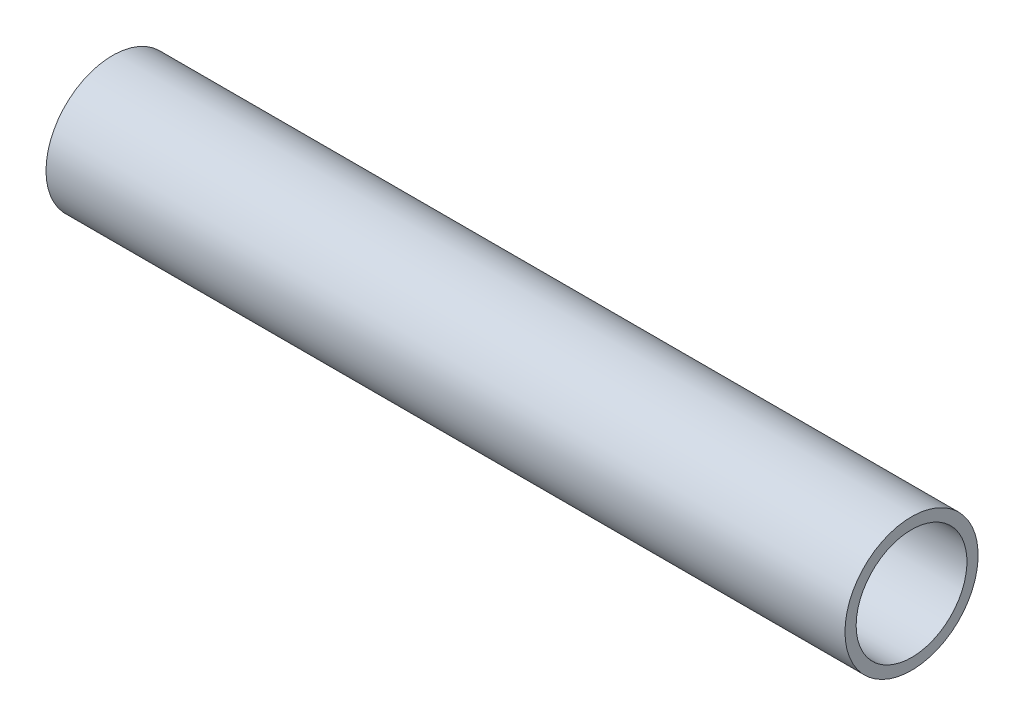
ISO-10303-21;
HEADER;
FILE_DESCRIPTION(('STEP AP214'),'2;1');
FILE_NAME('part.step','',(''),(''),'','','');
FILE_SCHEMA(('AUTOMOTIVE_DESIGN { 1 0 10303 214 1 1 1 1 }'));
ENDSEC;
DATA;
#1=APPLICATION_CONTEXT('core data for automotive mechanical design processes');
#2=APPLICATION_PROTOCOL_DEFINITION('international standard','automotive_design',2000,#1);
#3=PRODUCT_CONTEXT('',#1,'mechanical');
#4=PRODUCT('Part','Part','',(#3));
#5=PRODUCT_RELATED_PRODUCT_CATEGORY('part','',(#4));
#6=PRODUCT_DEFINITION_FORMATION('','',#4);
#7=PRODUCT_DEFINITION_CONTEXT('part definition',#1,'design');
#8=PRODUCT_DEFINITION('design','',#6,#7);
#9=PRODUCT_DEFINITION_SHAPE('','',#8);
#10=(LENGTH_UNIT() NAMED_UNIT(*) SI_UNIT(.MILLI.,.METRE.));
#11=(NAMED_UNIT(*) PLANE_ANGLE_UNIT() SI_UNIT($,.RADIAN.));
#12=(NAMED_UNIT(*) SI_UNIT($,.STERADIAN.) SOLID_ANGLE_UNIT());
#13=UNCERTAINTY_MEASURE_WITH_UNIT(LENGTH_MEASURE(1.E-05),#10,'distance_accuracy_value','');
#14=(GEOMETRIC_REPRESENTATION_CONTEXT(3) GLOBAL_UNCERTAINTY_ASSIGNED_CONTEXT((#13)) GLOBAL_UNIT_ASSIGNED_CONTEXT((#10,
#11,#12)) REPRESENTATION_CONTEXT('',''));
#15=CARTESIAN_POINT('',(0.,0.,0.));
#16=DIRECTION('',(0.,0.,1.));
#17=DIRECTION('',(1.,0.,0.));
#18=AXIS2_PLACEMENT_3D('',#15,#16,#17);
#19=CARTESIAN_POINT('',(25.2027542670464,670.040757757043,0.));
#20=DIRECTION('',(1.,0.,0.));
#21=DIRECTION('',(0.,0.,-1.));
#22=AXIS2_PLACEMENT_3D('',#19,#20,#21);
#23=CYLINDRICAL_SURFACE('',#22,5.28320000000004);
#24=CARTESIAN_POINT('',(25.2027542670464,670.040757757043,0.));
#25=DIRECTION('',(-1.,0.,0.));
#26=DIRECTION('',(0.,0.,1.));
#27=AXIS2_PLACEMENT_3D('',#24,#25,#26);
#28=CIRCLE('',#27,5.28320000000004);
#29=CARTESIAN_POINT('',(25.2027542670464,670.040757757043,5.28320000000004));
#30=VERTEX_POINT('',#29);
#31=EDGE_CURVE('E45',#30,#30,#28,.T.);
#32=ORIENTED_EDGE('',*,*,#31,.T.);
#33=EDGE_LOOP('',(#32));
#34=FACE_BOUND('',#33,.T.);
#35=CARTESIAN_POINT('',(101.402754267046,670.040757757043,0.));
#36=DIRECTION('',(-1.,0.,0.));
#37=DIRECTION('',(0.,0.,1.));
#38=AXIS2_PLACEMENT_3D('',#35,#36,#37);
#39=CIRCLE('',#38,5.28320000000004);
#40=CARTESIAN_POINT('',(101.402754267046,670.040757757043,5.28320000000004));
#41=VERTEX_POINT('',#40);
#42=EDGE_CURVE('E51',#41,#41,#39,.T.);
#43=ORIENTED_EDGE('',*,*,#42,.F.);
#44=EDGE_LOOP('',(#43));
#45=FACE_BOUND('',#44,.T.);
#46=ADVANCED_FACE('F38',(#34,#45),#23,.F.);
#47=CARTESIAN_POINT('',(25.2027542670464,670.040757757043,0.));
#48=DIRECTION('',(1.,0.,0.));
#49=DIRECTION('',(0.,0.,-1.));
#50=AXIS2_PLACEMENT_3D('',#47,#48,#49);
#51=CYLINDRICAL_SURFACE('',#50,6.35000000000005);
#52=CARTESIAN_POINT('',(25.2027542670464,670.040757757043,0.));
#53=DIRECTION('',(-1.,0.,0.));
#54=DIRECTION('',(0.,0.,1.));
#55=AXIS2_PLACEMENT_3D('',#52,#53,#54);
#56=CIRCLE('',#55,6.35000000000005);
#57=CARTESIAN_POINT('',(25.2027542670464,670.040757757043,6.35000000000005));
#58=VERTEX_POINT('',#57);
#59=EDGE_CURVE('E11',#58,#58,#56,.T.);
#60=ORIENTED_EDGE('',*,*,#59,.F.);
#61=EDGE_LOOP('',(#60));
#62=FACE_BOUND('',#61,.T.);
#63=CARTESIAN_POINT('',(101.402754267046,670.040757757043,0.));
#64=DIRECTION('',(-1.,0.,0.));
#65=DIRECTION('',(0.,0.,1.));
#66=AXIS2_PLACEMENT_3D('',#63,#64,#65);
#67=CIRCLE('',#66,6.35000000000005);
#68=CARTESIAN_POINT('',(101.402754267046,670.040757757043,6.35000000000005));
#69=VERTEX_POINT('',#68);
#70=EDGE_CURVE('E41',#69,#69,#67,.T.);
#71=ORIENTED_EDGE('',*,*,#70,.T.);
#72=EDGE_LOOP('',(#71));
#73=FACE_BOUND('',#72,.T.);
#74=ADVANCED_FACE('F58',(#62,#73),#51,.T.);
#75=CARTESIAN_POINT('',(25.2027542670464,670.040757757043,0.));
#76=DIRECTION('',(-1.,0.,0.));
#77=DIRECTION('',(0.,0.,1.));
#78=AXIS2_PLACEMENT_3D('',#75,#76,#77);
#79=PLANE('',#78);
#80=ORIENTED_EDGE('',*,*,#31,.F.);
#81=EDGE_LOOP('',(#80));
#82=FACE_BOUND('',#81,.T.);
#83=ORIENTED_EDGE('',*,*,#59,.T.);
#84=EDGE_LOOP('',(#83));
#85=FACE_BOUND('',#84,.T.);
#86=ADVANCED_FACE('F62',(#82,#85),#79,.T.);
#87=CARTESIAN_POINT('',(101.402754267046,670.040757757043,0.));
#88=DIRECTION('',(-1.,0.,0.));
#89=DIRECTION('',(0.,0.,1.));
#90=AXIS2_PLACEMENT_3D('',#87,#88,#89);
#91=PLANE('',#90);
#92=ORIENTED_EDGE('',*,*,#42,.T.);
#93=EDGE_LOOP('',(#92));
#94=FACE_BOUND('',#93,.T.);
#95=ORIENTED_EDGE('',*,*,#70,.F.);
#96=EDGE_LOOP('',(#95));
#97=FACE_BOUND('',#96,.T.);
#98=ADVANCED_FACE('F60',(#94,#97),#91,.F.);
#99=CLOSED_SHELL('',(#46,#74,#86,#98));
#100=MANIFOLD_SOLID_BREP('B2',#99);
#101=ADVANCED_BREP_SHAPE_REPRESENTATION('',(#18,#100),#14);
#102=SHAPE_DEFINITION_REPRESENTATION(#9,#101);
ENDSEC;
END-ISO-10303-21;
